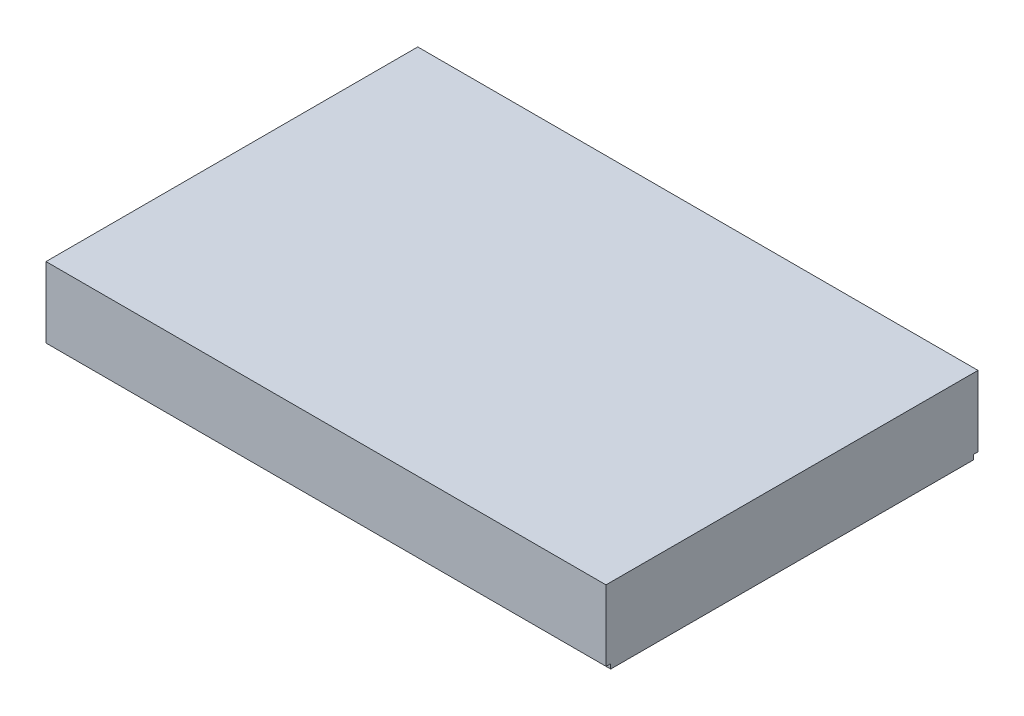
ISO-10303-21;
HEADER;
FILE_DESCRIPTION(('STEP AP214'),'2;1');
FILE_NAME('part.step','',(''),(''),'','','');
FILE_SCHEMA(('AUTOMOTIVE_DESIGN { 1 0 10303 214 1 1 1 1 }'));
ENDSEC;
DATA;
#1=APPLICATION_CONTEXT('core data for automotive mechanical design processes');
#2=APPLICATION_PROTOCOL_DEFINITION('international standard','automotive_design',2000,#1);
#3=PRODUCT_CONTEXT('',#1,'mechanical');
#4=PRODUCT('Part','Part','',(#3));
#5=PRODUCT_RELATED_PRODUCT_CATEGORY('part','',(#4));
#6=PRODUCT_DEFINITION_FORMATION('','',#4);
#7=PRODUCT_DEFINITION_CONTEXT('part definition',#1,'design');
#8=PRODUCT_DEFINITION('design','',#6,#7);
#9=PRODUCT_DEFINITION_SHAPE('','',#8);
#10=(LENGTH_UNIT() NAMED_UNIT(*) SI_UNIT(.MILLI.,.METRE.));
#11=(NAMED_UNIT(*) PLANE_ANGLE_UNIT() SI_UNIT($,.RADIAN.));
#12=(NAMED_UNIT(*) SI_UNIT($,.STERADIAN.) SOLID_ANGLE_UNIT());
#13=UNCERTAINTY_MEASURE_WITH_UNIT(LENGTH_MEASURE(1.E-05),#10,'distance_accuracy_value','');
#14=(GEOMETRIC_REPRESENTATION_CONTEXT(3) GLOBAL_UNCERTAINTY_ASSIGNED_CONTEXT((#13)) GLOBAL_UNIT_ASSIGNED_CONTEXT((#10,
#11,#12)) REPRESENTATION_CONTEXT('',''));
#15=CARTESIAN_POINT('',(0.,0.,0.));
#16=DIRECTION('',(0.,0.,1.));
#17=DIRECTION('',(1.,0.,0.));
#18=AXIS2_PLACEMENT_3D('',#15,#16,#17);
#19=CARTESIAN_POINT('',(0.681967213114738,0.,7.9));
#20=DIRECTION('',(0.,1.,0.));
#21=DIRECTION('',(0.,0.,1.));
#22=AXIS2_PLACEMENT_3D('',#19,#20,#21);
#23=PLANE('',#22);
#24=DIRECTION('',(-0.000706908069581635,0.,0.999999750140459));
#25=VECTOR('',#24,1.);
#26=CARTESIAN_POINT('',(24.4819553198021,0.,7.9168244078523));
#27=LINE('',#26,#25);
#28=CARTESIAN_POINT('',(24.4929949817556,0.,-7.7));
#29=VERTEX_POINT('',#28);
#30=CARTESIAN_POINT('',(24.482108594764,0.,7.7));
#31=VERTEX_POINT('',#30);
#32=EDGE_CURVE('E375',#29,#31,#27,.T.);
#33=ORIENTED_EDGE('',*,*,#32,.T.);
#34=DIRECTION('',(1.,0.,0.));
#35=VECTOR('',#34,1.);
#36=CARTESIAN_POINT('',(48.2819672131147,0.,7.7));
#37=LINE('',#36,#35);
#38=CARTESIAN_POINT('',(0.881967213114738,0.,7.7));
#39=VERTEX_POINT('',#38);
#40=EDGE_CURVE('E340',#39,#31,#37,.T.);
#41=ORIENTED_EDGE('',*,*,#40,.F.);
#42=DIRECTION('',(0.,0.,1.));
#43=VECTOR('',#42,1.);
#44=CARTESIAN_POINT('',(0.881967213114738,0.,-7.7021840237475));
#45=LINE('',#44,#43);
#46=CARTESIAN_POINT('',(0.881967213114738,0.,-7.7));
#47=VERTEX_POINT('',#46);
#48=EDGE_CURVE('E245',#47,#39,#45,.T.);
#49=ORIENTED_EDGE('',*,*,#48,.F.);
#50=DIRECTION('',(-1.,0.,0.));
#51=VECTOR('',#50,1.);
#52=CARTESIAN_POINT('',(0.881967213114738,0.,-7.7));
#53=LINE('',#52,#51);
#54=EDGE_CURVE('E241',#29,#47,#53,.T.);
#55=ORIENTED_EDGE('',*,*,#54,.F.);
#56=EDGE_LOOP('',(#33,#41,#49,#55));
#57=FACE_BOUND('',#56,.T.);
#58=DIRECTION('',(0.,0.,-1.));
#59=VECTOR('',#58,1.);
#60=CARTESIAN_POINT('',(23.2922880735094,0.,-6.7));
#61=LINE('',#60,#59);
#62=CARTESIAN_POINT('',(23.2922880735094,0.,6.7));
#63=VERTEX_POINT('',#62);
#64=CARTESIAN_POINT('',(23.2922880735094,0.,-6.7));
#65=VERTEX_POINT('',#64);
#66=EDGE_CURVE('E167',#63,#65,#61,.T.);
#67=ORIENTED_EDGE('',*,*,#66,.T.);
#68=DIRECTION('',(1.,0.,0.));
#69=VECTOR('',#68,1.);
#70=CARTESIAN_POINT('',(0.,0.,-6.7));
#71=LINE('',#70,#69);
#72=CARTESIAN_POINT('',(1.88196721311474,0.,-6.7));
#73=VERTEX_POINT('',#72);
#74=EDGE_CURVE('E195',#73,#65,#71,.T.);
#75=ORIENTED_EDGE('',*,*,#74,.F.);
#76=DIRECTION('',(0.,0.,-1.));
#77=VECTOR('',#76,1.);
#78=CARTESIAN_POINT('',(1.88196721311474,0.,7.9));
#79=LINE('',#78,#77);
#80=CARTESIAN_POINT('',(1.88196721311474,0.,6.7));
#81=VERTEX_POINT('',#80);
#82=EDGE_CURVE('E186',#81,#73,#79,.T.);
#83=ORIENTED_EDGE('',*,*,#82,.F.);
#84=DIRECTION('',(1.,0.,0.));
#85=VECTOR('',#84,1.);
#86=CARTESIAN_POINT('',(0.,0.,6.7));
#87=LINE('',#86,#85);
#88=EDGE_CURVE('E182',#81,#63,#87,.T.);
#89=ORIENTED_EDGE('',*,*,#88,.T.);
#90=EDGE_LOOP('',(#67,#75,#83,#89));
#91=FACE_BOUND('',#90,.T.);
#92=ADVANCED_FACE('F41',(#57,#91),#23,.F.);
#93=CARTESIAN_POINT('',(0.681967213114738,0.,7.9));
#94=DIRECTION('',(1.,0.,0.));
#95=DIRECTION('',(0.,0.,-1.));
#96=AXIS2_PLACEMENT_3D('',#93,#94,#95);
#97=PLANE('',#96);
#98=DIRECTION('',(0.,-1.,0.));
#99=VECTOR('',#98,1.);
#100=CARTESIAN_POINT('',(0.681967213114738,0.,-7.9));
#101=LINE('',#100,#99);
#102=CARTESIAN_POINT('',(0.681967213114738,3.2,-7.9));
#103=VERTEX_POINT('',#102);
#104=CARTESIAN_POINT('',(0.681967213114738,0.199766915545216,-7.9));
#105=VERTEX_POINT('',#104);
#106=EDGE_CURVE('E204',#103,#105,#101,.T.);
#107=ORIENTED_EDGE('',*,*,#106,.T.);
#108=DIRECTION('',(0.,0.,-1.));
#109=VECTOR('',#108,1.);
#110=CARTESIAN_POINT('',(0.681967213114738,0.199766915545216,-7.9));
#111=LINE('',#110,#109);
#112=CARTESIAN_POINT('',(0.681967213114738,0.199766915545217,7.9));
#113=VERTEX_POINT('',#112);
#114=EDGE_CURVE('E244',#113,#105,#111,.T.);
#115=ORIENTED_EDGE('',*,*,#114,.F.);
#116=DIRECTION('',(0.,-1.,0.));
#117=VECTOR('',#116,1.);
#118=CARTESIAN_POINT('',(0.681967213114738,0.,7.9));
#119=LINE('',#118,#117);
#120=CARTESIAN_POINT('',(0.681967213114738,3.2,7.9));
#121=VERTEX_POINT('',#120);
#122=EDGE_CURVE('E197',#121,#113,#119,.T.);
#123=ORIENTED_EDGE('',*,*,#122,.F.);
#124=DIRECTION('',(0.,0.,-1.));
#125=VECTOR('',#124,1.);
#126=CARTESIAN_POINT('',(0.681967213114738,3.2,7.9));
#127=LINE('',#126,#125);
#128=EDGE_CURVE('E203',#121,#103,#127,.T.);
#129=ORIENTED_EDGE('',*,*,#128,.T.);
#130=EDGE_LOOP('',(#107,#115,#123,#129));
#131=FACE_BOUND('',#130,.T.);
#132=ADVANCED_FACE('F396',(#131),#97,.F.);
#133=CARTESIAN_POINT('',(0.681967213114738,3.2,7.9));
#134=DIRECTION('',(0.,-1.,0.));
#135=DIRECTION('',(1.,0.,0.));
#136=AXIS2_PLACEMENT_3D('',#133,#134,#135);
#137=PLANE('',#136);
#138=DIRECTION('',(-1.,0.,0.));
#139=VECTOR('',#138,1.);
#140=CARTESIAN_POINT('',(0.681967213114738,3.2,7.9));
#141=LINE('',#140,#139);
#142=CARTESIAN_POINT('',(24.4819672131147,3.2,7.9));
#143=VERTEX_POINT('',#142);
#144=EDGE_CURVE('E200',#143,#121,#141,.T.);
#145=ORIENTED_EDGE('',*,*,#144,.F.);
#146=DIRECTION('',(0.000706908069581635,0.,-0.999999750140459));
#147=VECTOR('',#146,1.);
#148=CARTESIAN_POINT('',(24.4931363634049,3.2,-7.9));
#149=LINE('',#148,#147);
#150=CARTESIAN_POINT('',(24.4931363634049,3.2,-7.9));
#151=VERTEX_POINT('',#150);
#152=EDGE_CURVE('E377',#143,#151,#149,.T.);
#153=ORIENTED_EDGE('',*,*,#152,.T.);
#154=DIRECTION('',(-1.,0.,0.));
#155=VECTOR('',#154,1.);
#156=CARTESIAN_POINT('',(0.681967213114738,3.2,-7.9));
#157=LINE('',#156,#155);
#158=EDGE_CURVE('E201',#151,#103,#157,.T.);
#159=ORIENTED_EDGE('',*,*,#158,.T.);
#160=ORIENTED_EDGE('',*,*,#128,.F.);
#161=EDGE_LOOP('',(#145,#153,#159,#160));
#162=FACE_BOUND('',#161,.T.);
#163=ADVANCED_FACE('F398',(#162),#137,.F.);
#164=CARTESIAN_POINT('',(0.,0.,7.9));
#165=DIRECTION('',(0.,0.,-1.));
#166=DIRECTION('',(-1.,0.,0.));
#167=AXIS2_PLACEMENT_3D('',#164,#165,#166);
#168=PLANE('',#167);
#169=DIRECTION('',(-1.,0.,0.));
#170=VECTOR('',#169,1.);
#171=CARTESIAN_POINT('',(0.881967213114738,0.199766915545217,7.9));
#172=LINE('',#171,#170);
#173=CARTESIAN_POINT('',(24.4819672131147,0.199766915545216,7.9));
#174=VERTEX_POINT('',#173);
#175=EDGE_CURVE('E250',#174,#113,#172,.T.);
#176=ORIENTED_EDGE('',*,*,#175,.F.);
#177=DIRECTION('',(0.,-1.,0.));
#178=VECTOR('',#177,1.);
#179=CARTESIAN_POINT('',(24.4819672131147,3.2,7.9));
#180=LINE('',#179,#178);
#181=EDGE_CURVE('E373',#143,#174,#180,.T.);
#182=ORIENTED_EDGE('',*,*,#181,.F.);
#183=ORIENTED_EDGE('',*,*,#144,.T.);
#184=ORIENTED_EDGE('',*,*,#122,.T.);
#185=EDGE_LOOP('',(#176,#182,#183,#184));
#186=FACE_BOUND('',#185,.T.);
#187=ADVANCED_FACE('F391',(#186),#168,.F.);
#188=CARTESIAN_POINT('',(0.,0.,-7.9));
#189=DIRECTION('',(0.,0.,-1.));
#190=DIRECTION('',(-1.,0.,0.));
#191=AXIS2_PLACEMENT_3D('',#188,#189,#190);
#192=PLANE('',#191);
#193=DIRECTION('',(0.,-1.,0.));
#194=VECTOR('',#193,1.);
#195=CARTESIAN_POINT('',(24.4931363634049,3.2,-7.9));
#196=LINE('',#195,#194);
#197=CARTESIAN_POINT('',(24.4931363634049,0.201578175841326,-7.9));
#198=VERTEX_POINT('',#197);
#199=EDGE_CURVE('E371',#151,#198,#196,.T.);
#200=ORIENTED_EDGE('',*,*,#199,.T.);
#201=DIRECTION('',(0.999999997057616,7.67122416557049E-05,0.));
#202=VECTOR('',#201,1.);
#203=CARTESIAN_POINT('',(48.4819672131147,0.203418418258773,-7.9));
#204=LINE('',#203,#202);
#205=CARTESIAN_POINT('',(0.881967213114738,0.199766915545217,-7.9));
#206=VERTEX_POINT('',#205);
#207=EDGE_CURVE('E238',#206,#198,#204,.T.);
#208=ORIENTED_EDGE('',*,*,#207,.F.);
#209=DIRECTION('',(-1.,0.,0.));
#210=VECTOR('',#209,1.);
#211=CARTESIAN_POINT('',(0.881967213114738,0.199766915545216,-7.9));
#212=LINE('',#211,#210);
#213=EDGE_CURVE('E252',#206,#105,#212,.T.);
#214=ORIENTED_EDGE('',*,*,#213,.T.);
#215=ORIENTED_EDGE('',*,*,#106,.F.);
#216=ORIENTED_EDGE('',*,*,#158,.F.);
#217=EDGE_LOOP('',(#200,#208,#214,#215,#216));
#218=FACE_BOUND('',#217,.T.);
#219=ADVANCED_FACE('F368',(#218),#192,.T.);
#220=CARTESIAN_POINT('',(1.88196721311474,0.,7.9));
#221=DIRECTION('',(1.,0.,0.));
#222=DIRECTION('',(0.,0.,-1.));
#223=AXIS2_PLACEMENT_3D('',#220,#221,#222);
#224=PLANE('',#223);
#225=DIRECTION('',(0.,-1.,0.));
#226=VECTOR('',#225,1.);
#227=CARTESIAN_POINT('',(1.88196721311474,2.4,-2.49948215339272));
#228=LINE('',#227,#226);
#229=CARTESIAN_POINT('',(1.88196721311474,2.2,-2.49948215339272));
#230=VERTEX_POINT('',#229);
#231=CARTESIAN_POINT('',(1.88196721311474,2.,-2.49948215339272));
#232=VERTEX_POINT('',#231);
#233=EDGE_CURVE('E288',#230,#232,#228,.T.);
#234=ORIENTED_EDGE('',*,*,#233,.F.);
#235=DIRECTION('',(0.,0.,-1.));
#236=VECTOR('',#235,1.);
#237=CARTESIAN_POINT('',(1.88196721311474,2.2,7.9));
#238=LINE('',#237,#236);
#239=CARTESIAN_POINT('',(1.88196721311474,2.2,2.50210016185098));
#240=VERTEX_POINT('',#239);
#241=EDGE_CURVE('E290',#230,#240,#238,.F.);
#242=ORIENTED_EDGE('',*,*,#241,.T.);
#243=DIRECTION('',(0.,-1.,0.));
#244=VECTOR('',#243,1.);
#245=CARTESIAN_POINT('',(1.88196721311474,2.4,2.50210016185098));
#246=LINE('',#245,#244);
#247=CARTESIAN_POINT('',(1.88196721311474,2.,2.50210016185098));
#248=VERTEX_POINT('',#247);
#249=EDGE_CURVE('E338',#240,#248,#246,.T.);
#250=ORIENTED_EDGE('',*,*,#249,.T.);
#251=DIRECTION('',(0.,0.,-1.));
#252=VECTOR('',#251,1.);
#253=CARTESIAN_POINT('',(1.88196721311474,2.,7.9));
#254=LINE('',#253,#252);
#255=CARTESIAN_POINT('',(1.88196721311474,2.,6.7));
#256=VERTEX_POINT('',#255);
#257=EDGE_CURVE('E267',#256,#248,#254,.T.);
#258=ORIENTED_EDGE('',*,*,#257,.F.);
#259=DIRECTION('',(0.,-1.,0.));
#260=VECTOR('',#259,1.);
#261=CARTESIAN_POINT('',(1.88196721311474,0.,6.7));
#262=LINE('',#261,#260);
#263=EDGE_CURVE('E187',#256,#81,#262,.T.);
#264=ORIENTED_EDGE('',*,*,#263,.T.);
#265=ORIENTED_EDGE('',*,*,#82,.T.);
#266=DIRECTION('',(0.,-1.,0.));
#267=VECTOR('',#266,1.);
#268=CARTESIAN_POINT('',(1.88196721311474,0.,-6.7));
#269=LINE('',#268,#267);
#270=CARTESIAN_POINT('',(1.88196721311474,2.,-6.7));
#271=VERTEX_POINT('',#270);
#272=EDGE_CURVE('E217',#271,#73,#269,.T.);
#273=ORIENTED_EDGE('',*,*,#272,.F.);
#274=EDGE_CURVE('E189',#232,#271,#254,.T.);
#275=ORIENTED_EDGE('',*,*,#274,.F.);
#276=EDGE_LOOP('',(#234,#242,#250,#258,#264,#265,#273,#275));
#277=FACE_BOUND('',#276,.T.);
#278=ADVANCED_FACE('F273',(#277),#224,.T.);
#279=CARTESIAN_POINT('',(0.681967213114738,2.,7.9));
#280=DIRECTION('',(0.,-1.,0.));
#281=DIRECTION('',(1.,0.,0.));
#282=AXIS2_PLACEMENT_3D('',#279,#280,#281);
#283=PLANE('',#282);
#284=DIRECTION('',(0.,0.,-1.));
#285=VECTOR('',#284,1.);
#286=CARTESIAN_POINT('',(23.2922880735094,2.,-6.7));
#287=LINE('',#286,#285);
#288=CARTESIAN_POINT('',(23.2922880735094,2.,6.7));
#289=VERTEX_POINT('',#288);
#290=CARTESIAN_POINT('',(23.2922880735094,2.,-6.7));
#291=VERTEX_POINT('',#290);
#292=EDGE_CURVE('E56',#289,#291,#287,.T.);
#293=ORIENTED_EDGE('',*,*,#292,.F.);
#294=DIRECTION('',(-1.,0.,0.));
#295=VECTOR('',#294,1.);
#296=CARTESIAN_POINT('',(0.,2.,6.7));
#297=LINE('',#296,#295);
#298=EDGE_CURVE('E184',#289,#256,#297,.T.);
#299=ORIENTED_EDGE('',*,*,#298,.T.);
#300=ORIENTED_EDGE('',*,*,#257,.T.);
#301=DIRECTION('',(-1.,0.,0.));
#302=VECTOR('',#301,1.);
#303=CARTESIAN_POINT('',(1.88196721311474,2.,2.50210016185098));
#304=LINE('',#303,#302);
#305=CARTESIAN_POINT('',(2.38194248084373,2.,2.50210016185098));
#306=VERTEX_POINT('',#305);
#307=EDGE_CURVE('E294',#306,#248,#304,.T.);
#308=ORIENTED_EDGE('',*,*,#307,.F.);
#309=DIRECTION('',(0.,0.,1.));
#310=VECTOR('',#309,1.);
#311=CARTESIAN_POINT('',(2.38194248084373,2.,2.50210016185098));
#312=LINE('',#311,#310);
#313=CARTESIAN_POINT('',(2.38194248084373,2.,-2.49948215339272));
#314=VERTEX_POINT('',#313);
#315=EDGE_CURVE('E329',#314,#306,#312,.T.);
#316=ORIENTED_EDGE('',*,*,#315,.F.);
#317=DIRECTION('',(1.,0.,0.));
#318=VECTOR('',#317,1.);
#319=CARTESIAN_POINT('',(2.38194248084373,2.,-2.49948215339272));
#320=LINE('',#319,#318);
#321=EDGE_CURVE('E286',#232,#314,#320,.T.);
#322=ORIENTED_EDGE('',*,*,#321,.F.);
#323=ORIENTED_EDGE('',*,*,#274,.T.);
#324=DIRECTION('',(-1.,0.,0.));
#325=VECTOR('',#324,1.);
#326=CARTESIAN_POINT('',(0.,2.,-6.7));
#327=LINE('',#326,#325);
#328=EDGE_CURVE('E191',#291,#271,#327,.T.);
#329=ORIENTED_EDGE('',*,*,#328,.F.);
#330=EDGE_LOOP('',(#293,#299,#300,#308,#316,#322,#323,#329));
#331=FACE_BOUND('',#330,.T.);
#332=CARTESIAN_POINT('',(16.5819672131147,2.,0.));
#333=DIRECTION('',(0.,-1.,0.));
#334=DIRECTION('',(1.,0.,0.));
#335=AXIS2_PLACEMENT_3D('',#332,#333,#334);
#336=CIRCLE('',#335,3.25);
#337=CARTESIAN_POINT('',(19.8319672131147,2.,0.));
#338=VERTEX_POINT('',#337);
#339=EDGE_CURVE('E222',#338,#338,#336,.F.);
#340=ORIENTED_EDGE('',*,*,#339,.T.);
#341=EDGE_LOOP('',(#340));
#342=FACE_BOUND('',#341,.T.);
#343=CARTESIAN_POINT('',(8.58196721311474,2.,0.));
#344=DIRECTION('',(0.,-1.,0.));
#345=DIRECTION('',(1.,0.,0.));
#346=AXIS2_PLACEMENT_3D('',#343,#344,#345);
#347=CIRCLE('',#346,3.25);
#348=CARTESIAN_POINT('',(11.8319672131147,2.,0.));
#349=VERTEX_POINT('',#348);
#350=EDGE_CURVE('E214',#349,#349,#347,.F.);
#351=ORIENTED_EDGE('',*,*,#350,.T.);
#352=EDGE_LOOP('',(#351));
#353=FACE_BOUND('',#352,.T.);
#354=ADVANCED_FACE('F282',(#331,#342,#353),#283,.T.);
#355=CARTESIAN_POINT('',(0.,0.,6.7));
#356=DIRECTION('',(0.,0.,-1.));
#357=DIRECTION('',(-1.,0.,0.));
#358=AXIS2_PLACEMENT_3D('',#355,#356,#357);
#359=PLANE('',#358);
#360=DIRECTION('',(0.,1.,0.));
#361=VECTOR('',#360,1.);
#362=CARTESIAN_POINT('',(23.2922880735094,0.,6.7));
#363=LINE('',#362,#361);
#364=EDGE_CURVE('E170',#63,#289,#363,.T.);
#365=ORIENTED_EDGE('',*,*,#364,.F.);
#366=ORIENTED_EDGE('',*,*,#88,.F.);
#367=ORIENTED_EDGE('',*,*,#263,.F.);
#368=ORIENTED_EDGE('',*,*,#298,.F.);
#369=EDGE_LOOP('',(#365,#366,#367,#368));
#370=FACE_BOUND('',#369,.T.);
#371=ADVANCED_FACE('F180',(#370),#359,.T.);
#372=CARTESIAN_POINT('',(0.,0.,-6.7));
#373=DIRECTION('',(0.,0.,-1.));
#374=DIRECTION('',(-1.,0.,0.));
#375=AXIS2_PLACEMENT_3D('',#372,#373,#374);
#376=PLANE('',#375);
#377=ORIENTED_EDGE('',*,*,#74,.T.);
#378=DIRECTION('',(0.,1.,0.));
#379=VECTOR('',#378,1.);
#380=CARTESIAN_POINT('',(23.2922880735094,0.,-6.7));
#381=LINE('',#380,#379);
#382=EDGE_CURVE('E171',#65,#291,#381,.T.);
#383=ORIENTED_EDGE('',*,*,#382,.T.);
#384=ORIENTED_EDGE('',*,*,#328,.T.);
#385=ORIENTED_EDGE('',*,*,#272,.T.);
#386=EDGE_LOOP('',(#377,#383,#384,#385));
#387=FACE_BOUND('',#386,.T.);
#388=ADVANCED_FACE('F277',(#387),#376,.F.);
#389=CARTESIAN_POINT('',(8.58196721311474,-0.2,0.));
#390=DIRECTION('',(0.,-1.,0.));
#391=DIRECTION('',(0.,0.,-1.));
#392=AXIS2_PLACEMENT_3D('',#389,#390,#391);
#393=PLANE('',#392);
#394=CARTESIAN_POINT('',(8.58196721311474,-0.2,0.));
#395=DIRECTION('',(0.,-1.,0.));
#396=DIRECTION('',(0.,0.,-1.));
#397=AXIS2_PLACEMENT_3D('',#394,#395,#396);
#398=CIRCLE('',#397,3.25);
#399=CARTESIAN_POINT('',(8.58196721311474,-0.2,-3.25));
#400=VERTEX_POINT('',#399);
#401=EDGE_CURVE('E218',#400,#400,#398,.T.);
#402=ORIENTED_EDGE('',*,*,#401,.T.);
#403=EDGE_LOOP('',(#402));
#404=FACE_BOUND('',#403,.T.);
#405=CARTESIAN_POINT('',(8.58196721311474,-0.2,0.));
#406=DIRECTION('',(0.,-1.,0.));
#407=DIRECTION('',(0.,0.,-1.));
#408=AXIS2_PLACEMENT_3D('',#405,#406,#407);
#409=CIRCLE('',#408,2.4);
#410=CARTESIAN_POINT('',(8.58196721311474,-0.2,-2.4));
#411=VERTEX_POINT('',#410);
#412=EDGE_CURVE('E225',#411,#411,#409,.T.);
#413=ORIENTED_EDGE('',*,*,#412,.F.);
#414=EDGE_LOOP('',(#413));
#415=FACE_BOUND('',#414,.T.);
#416=ADVANCED_FACE('F487',(#404,#415),#393,.T.);
#417=CARTESIAN_POINT('',(8.58196721311474,-0.2,0.));
#418=DIRECTION('',(0.,1.,0.));
#419=DIRECTION('',(0.,0.,1.));
#420=AXIS2_PLACEMENT_3D('',#417,#418,#419);
#421=CYLINDRICAL_SURFACE('',#420,3.25);
#422=ORIENTED_EDGE('',*,*,#350,.F.);
#423=EDGE_LOOP('',(#422));
#424=FACE_BOUND('',#423,.T.);
#425=ORIENTED_EDGE('',*,*,#401,.F.);
#426=EDGE_LOOP('',(#425));
#427=FACE_BOUND('',#426,.T.);
#428=ADVANCED_FACE('F485',(#424,#427),#421,.T.);
#429=CARTESIAN_POINT('',(8.58196721311474,-0.2,0.));
#430=DIRECTION('',(0.,1.,0.));
#431=DIRECTION('',(0.,0.,1.));
#432=AXIS2_PLACEMENT_3D('',#429,#430,#431);
#433=CYLINDRICAL_SURFACE('',#432,2.4);
#434=CARTESIAN_POINT('',(8.58196721311474,2.,0.));
#435=DIRECTION('',(0.,-1.,0.));
#436=DIRECTION('',(1.,0.,0.));
#437=AXIS2_PLACEMENT_3D('',#434,#435,#436);
#438=CIRCLE('',#437,2.4);
#439=CARTESIAN_POINT('',(10.9819672131147,2.,0.));
#440=VERTEX_POINT('',#439);
#441=EDGE_CURVE('E210',#440,#440,#438,.F.);
#442=ORIENTED_EDGE('',*,*,#441,.T.);
#443=EDGE_LOOP('',(#442));
#444=FACE_BOUND('',#443,.T.);
#445=ORIENTED_EDGE('',*,*,#412,.T.);
#446=EDGE_LOOP('',(#445));
#447=FACE_BOUND('',#446,.T.);
#448=ADVANCED_FACE('F482',(#444,#447),#433,.F.);
#449=ORIENTED_EDGE('',*,*,#441,.F.);
#450=EDGE_LOOP('',(#449));
#451=FACE_BOUND('',#450,.T.);
#452=ADVANCED_FACE('F477',(#451),#283,.T.);
#453=CARTESIAN_POINT('',(16.5819672131147,-0.2,0.));
#454=DIRECTION('',(0.,-1.,0.));
#455=DIRECTION('',(0.,0.,-1.));
#456=AXIS2_PLACEMENT_3D('',#453,#454,#455);
#457=PLANE('',#456);
#458=CARTESIAN_POINT('',(16.5819672131147,-0.2,0.));
#459=DIRECTION('',(0.,-1.,0.));
#460=DIRECTION('',(0.,0.,-1.));
#461=AXIS2_PLACEMENT_3D('',#458,#459,#460);
#462=CIRCLE('',#461,3.25);
#463=CARTESIAN_POINT('',(16.5819672131147,-0.2,-3.25));
#464=VERTEX_POINT('',#463);
#465=EDGE_CURVE('E226',#464,#464,#462,.T.);
#466=ORIENTED_EDGE('',*,*,#465,.T.);
#467=EDGE_LOOP('',(#466));
#468=FACE_BOUND('',#467,.T.);
#469=CARTESIAN_POINT('',(16.5819672131147,-0.2,0.));
#470=DIRECTION('',(0.,-1.,0.));
#471=DIRECTION('',(0.,0.,-1.));
#472=AXIS2_PLACEMENT_3D('',#469,#470,#471);
#473=CIRCLE('',#472,2.4);
#474=CARTESIAN_POINT('',(16.5819672131147,-0.2,-2.4));
#475=VERTEX_POINT('',#474);
#476=EDGE_CURVE('E255',#475,#475,#473,.T.);
#477=ORIENTED_EDGE('',*,*,#476,.F.);
#478=EDGE_LOOP('',(#477));
#479=FACE_BOUND('',#478,.T.);
#480=ADVANCED_FACE('F474',(#468,#479),#457,.T.);
#481=CARTESIAN_POINT('',(16.5819672131147,-0.2,0.));
#482=DIRECTION('',(0.,1.,0.));
#483=DIRECTION('',(0.,0.,1.));
#484=AXIS2_PLACEMENT_3D('',#481,#482,#483);
#485=CYLINDRICAL_SURFACE('',#484,3.25);
#486=ORIENTED_EDGE('',*,*,#339,.F.);
#487=EDGE_LOOP('',(#486));
#488=FACE_BOUND('',#487,.T.);
#489=ORIENTED_EDGE('',*,*,#465,.F.);
#490=EDGE_LOOP('',(#489));
#491=FACE_BOUND('',#490,.T.);
#492=ADVANCED_FACE('F472',(#488,#491),#485,.T.);
#493=CARTESIAN_POINT('',(16.5819672131147,-0.2,0.));
#494=DIRECTION('',(0.,1.,0.));
#495=DIRECTION('',(0.,0.,1.));
#496=AXIS2_PLACEMENT_3D('',#493,#494,#495);
#497=CYLINDRICAL_SURFACE('',#496,2.4);
#498=CARTESIAN_POINT('',(16.5819672131147,2.,0.));
#499=DIRECTION('',(0.,-1.,0.));
#500=DIRECTION('',(1.,0.,0.));
#501=AXIS2_PLACEMENT_3D('',#498,#499,#500);
#502=CIRCLE('',#501,2.4);
#503=CARTESIAN_POINT('',(18.9819672131147,2.,0.));
#504=VERTEX_POINT('',#503);
#505=EDGE_CURVE('E213',#504,#504,#502,.F.);
#506=ORIENTED_EDGE('',*,*,#505,.T.);
#507=EDGE_LOOP('',(#506));
#508=FACE_BOUND('',#507,.T.);
#509=ORIENTED_EDGE('',*,*,#476,.T.);
#510=EDGE_LOOP('',(#509));
#511=FACE_BOUND('',#510,.T.);
#512=ADVANCED_FACE('F469',(#508,#511),#497,.F.);
#513=ORIENTED_EDGE('',*,*,#505,.F.);
#514=EDGE_LOOP('',(#513));
#515=FACE_BOUND('',#514,.T.);
#516=ADVANCED_FACE('F468',(#515),#283,.T.);
#517=CARTESIAN_POINT('',(0.881967213114738,0.199766915545216,-7.9));
#518=DIRECTION('',(0.,1.,0.));
#519=DIRECTION('',(0.,0.,1.));
#520=AXIS2_PLACEMENT_3D('',#517,#518,#519);
#521=PLANE('',#520);
#522=DIRECTION('',(-1.,0.,0.));
#523=VECTOR('',#522,1.);
#524=CARTESIAN_POINT('',(0.881967213114738,0.199766915545217,7.7));
#525=LINE('',#524,#523);
#526=CARTESIAN_POINT('',(24.482108594764,0.199766915545217,7.7));
#527=VERTEX_POINT('',#526);
#528=CARTESIAN_POINT('',(0.881967213114738,0.199766915545217,7.7));
#529=VERTEX_POINT('',#528);
#530=EDGE_CURVE('E346',#527,#529,#525,.T.);
#531=ORIENTED_EDGE('',*,*,#530,.F.);
#532=DIRECTION('',(-0.000706908069581635,0.,0.999999750140459));
#533=VECTOR('',#532,1.);
#534=CARTESIAN_POINT('',(24.4931245644546,0.199766915545216,-7.88330907816579));
#535=LINE('',#534,#533);
#536=EDGE_CURVE('E64',#527,#174,#535,.T.);
#537=ORIENTED_EDGE('',*,*,#536,.T.);
#538=ORIENTED_EDGE('',*,*,#175,.T.);
#539=ORIENTED_EDGE('',*,*,#114,.T.);
#540=ORIENTED_EDGE('',*,*,#213,.F.);
#541=DIRECTION('',(0.,0.,-1.));
#542=VECTOR('',#541,1.);
#543=CARTESIAN_POINT('',(0.881967213114738,0.199766915545217,-7.7));
#544=LINE('',#543,#542);
#545=CARTESIAN_POINT('',(0.881967213114738,0.199766915545217,-7.7));
#546=VERTEX_POINT('',#545);
#547=EDGE_CURVE('E231',#546,#206,#544,.T.);
#548=ORIENTED_EDGE('',*,*,#547,.F.);
#549=DIRECTION('',(0.,0.,-1.));
#550=VECTOR('',#549,1.);
#551=CARTESIAN_POINT('',(0.881967213114738,0.199766915545217,7.9));
#552=LINE('',#551,#550);
#553=EDGE_CURVE('E248',#529,#546,#552,.T.);
#554=ORIENTED_EDGE('',*,*,#553,.F.);
#555=EDGE_LOOP('',(#531,#537,#538,#539,#540,#548,#554));
#556=FACE_BOUND('',#555,.T.);
#557=ADVANCED_FACE('F362',(#556),#521,.F.);
#558=CARTESIAN_POINT('',(0.881967213114738,0.,0.));
#559=DIRECTION('',(1.,0.,0.));
#560=DIRECTION('',(0.,0.,-1.));
#561=AXIS2_PLACEMENT_3D('',#558,#559,#560);
#562=PLANE('',#561);
#563=ORIENTED_EDGE('',*,*,#48,.T.);
#564=DIRECTION('',(0.,-1.,0.));
#565=VECTOR('',#564,1.);
#566=CARTESIAN_POINT('',(0.881967213114738,0.,7.7));
#567=LINE('',#566,#565);
#568=EDGE_CURVE('E242',#529,#39,#567,.T.);
#569=ORIENTED_EDGE('',*,*,#568,.F.);
#570=ORIENTED_EDGE('',*,*,#553,.T.);
#571=DIRECTION('',(0.,1.,0.));
#572=VECTOR('',#571,1.);
#573=CARTESIAN_POINT('',(0.881967213114738,0.199766915545217,-7.7));
#574=LINE('',#573,#572);
#575=EDGE_CURVE('E232',#47,#546,#574,.T.);
#576=ORIENTED_EDGE('',*,*,#575,.F.);
#577=EDGE_LOOP('',(#563,#569,#570,#576));
#578=FACE_BOUND('',#577,.T.);
#579=ADVANCED_FACE('F384',(#578),#562,.F.);
#580=CARTESIAN_POINT('',(48.4819672131147,0.203418418258773,-7.7));
#581=DIRECTION('',(-7.67122416557049E-05,0.999999997057616,0.));
#582=DIRECTION('',(-0.999999997057616,-7.67122416557049E-05,0.));
#583=AXIS2_PLACEMENT_3D('',#580,#581,#582);
#584=PLANE('',#583);
#585=ORIENTED_EDGE('',*,*,#207,.T.);
#586=DIRECTION('',(-0.000706908069581634,-5.42285028216752E-08,0.999999750140458));
#587=VECTOR('',#586,1.);
#588=CARTESIAN_POINT('',(24.4930069695013,0.201578171338081,-7.71695799391399));
#589=LINE('',#588,#587);
#590=CARTESIAN_POINT('',(24.4929949817556,0.201578170418474,-7.7));
#591=VERTEX_POINT('',#590);
#592=EDGE_CURVE('E314',#198,#591,#589,.T.);
#593=ORIENTED_EDGE('',*,*,#592,.T.);
#594=DIRECTION('',(0.999999997057616,7.67122416557049E-05,0.));
#595=VECTOR('',#594,1.);
#596=CARTESIAN_POINT('',(48.4819672131147,0.203418418258773,-7.7));
#597=LINE('',#596,#595);
#598=EDGE_CURVE('E227',#546,#591,#597,.T.);
#599=ORIENTED_EDGE('',*,*,#598,.F.);
#600=ORIENTED_EDGE('',*,*,#547,.T.);
#601=EDGE_LOOP('',(#585,#593,#599,#600));
#602=FACE_BOUND('',#601,.T.);
#603=ADVANCED_FACE('F365',(#602),#584,.F.);
#604=CARTESIAN_POINT('',(0.,0.,-7.7));
#605=DIRECTION('',(0.,0.,1.));
#606=DIRECTION('',(1.,0.,0.));
#607=AXIS2_PLACEMENT_3D('',#604,#605,#606);
#608=PLANE('',#607);
#609=ORIENTED_EDGE('',*,*,#598,.T.);
#610=DIRECTION('',(0.,-1.,0.));
#611=VECTOR('',#610,1.);
#612=CARTESIAN_POINT('',(24.4929949817556,0.,-7.7));
#613=LINE('',#612,#611);
#614=EDGE_CURVE('E319',#591,#29,#613,.T.);
#615=ORIENTED_EDGE('',*,*,#614,.T.);
#616=ORIENTED_EDGE('',*,*,#54,.T.);
#617=ORIENTED_EDGE('',*,*,#575,.T.);
#618=EDGE_LOOP('',(#609,#615,#616,#617));
#619=FACE_BOUND('',#618,.T.);
#620=ADVANCED_FACE('F354',(#619),#608,.F.);
#621=CARTESIAN_POINT('',(0.,0.,7.7));
#622=DIRECTION('',(0.,0.,-1.));
#623=DIRECTION('',(-1.,0.,0.));
#624=AXIS2_PLACEMENT_3D('',#621,#622,#623);
#625=PLANE('',#624);
#626=ORIENTED_EDGE('',*,*,#40,.T.);
#627=DIRECTION('',(0.,1.,0.));
#628=VECTOR('',#627,1.);
#629=CARTESIAN_POINT('',(24.482108594764,0.,7.7));
#630=LINE('',#629,#628);
#631=EDGE_CURVE('E11',#31,#527,#630,.T.);
#632=ORIENTED_EDGE('',*,*,#631,.T.);
#633=ORIENTED_EDGE('',*,*,#530,.T.);
#634=ORIENTED_EDGE('',*,*,#568,.T.);
#635=EDGE_LOOP('',(#626,#632,#633,#634));
#636=FACE_BOUND('',#635,.T.);
#637=ADVANCED_FACE('F386',(#636),#625,.F.);
#638=CARTESIAN_POINT('',(1.88196721311474,2.4,2.50210016185098));
#639=DIRECTION('',(0.,0.,1.));
#640=DIRECTION('',(1.,0.,0.));
#641=AXIS2_PLACEMENT_3D('',#638,#639,#640);
#642=PLANE('',#641);
#643=ORIENTED_EDGE('',*,*,#249,.F.);
#644=DIRECTION('',(-1.,0.,0.));
#645=VECTOR('',#644,1.);
#646=CARTESIAN_POINT('',(2.38194248084373,2.2,2.50210016185098));
#647=LINE('',#646,#645);
#648=CARTESIAN_POINT('',(2.38194248084373,2.2,2.50210016185098));
#649=VERTEX_POINT('',#648);
#650=EDGE_CURVE('E49',#240,#649,#647,.F.);
#651=ORIENTED_EDGE('',*,*,#650,.T.);
#652=DIRECTION('',(0.,-1.,0.));
#653=VECTOR('',#652,1.);
#654=CARTESIAN_POINT('',(2.38194248084373,2.4,2.50210016185098));
#655=LINE('',#654,#653);
#656=EDGE_CURVE('E341',#649,#306,#655,.T.);
#657=ORIENTED_EDGE('',*,*,#656,.T.);
#658=ORIENTED_EDGE('',*,*,#307,.T.);
#659=EDGE_LOOP('',(#643,#651,#657,#658));
#660=FACE_BOUND('',#659,.T.);
#661=ADVANCED_FACE('F446',(#660),#642,.F.);
#662=CARTESIAN_POINT('',(2.38194248084373,2.4,2.50210016185098));
#663=DIRECTION('',(1.,0.,0.));
#664=DIRECTION('',(0.,1.,0.));
#665=AXIS2_PLACEMENT_3D('',#662,#663,#664);
#666=PLANE('',#665);
#667=ORIENTED_EDGE('',*,*,#656,.F.);
#668=DIRECTION('',(0.,0.,1.));
#669=VECTOR('',#668,1.);
#670=CARTESIAN_POINT('',(2.38194248084373,2.2,-2.49948215339272));
#671=LINE('',#670,#669);
#672=CARTESIAN_POINT('',(2.38194248084373,2.2,-2.49948215339272));
#673=VERTEX_POINT('',#672);
#674=EDGE_CURVE('E305',#649,#673,#671,.F.);
#675=ORIENTED_EDGE('',*,*,#674,.T.);
#676=DIRECTION('',(0.,-1.,0.));
#677=VECTOR('',#676,1.);
#678=CARTESIAN_POINT('',(2.38194248084373,2.4,-2.49948215339272));
#679=LINE('',#678,#677);
#680=EDGE_CURVE('E293',#673,#314,#679,.T.);
#681=ORIENTED_EDGE('',*,*,#680,.T.);
#682=ORIENTED_EDGE('',*,*,#315,.T.);
#683=EDGE_LOOP('',(#667,#675,#681,#682));
#684=FACE_BOUND('',#683,.T.);
#685=ADVANCED_FACE('F448',(#684),#666,.F.);
#686=CARTESIAN_POINT('',(2.38194248084373,2.4,-2.49948215339272));
#687=DIRECTION('',(0.,0.,-1.));
#688=DIRECTION('',(-1.,0.,0.));
#689=AXIS2_PLACEMENT_3D('',#686,#687,#688);
#690=PLANE('',#689);
#691=ORIENTED_EDGE('',*,*,#680,.F.);
#692=DIRECTION('',(1.,0.,0.));
#693=VECTOR('',#692,1.);
#694=CARTESIAN_POINT('',(1.88196721311474,2.2,-2.49948215339272));
#695=LINE('',#694,#693);
#696=EDGE_CURVE('E312',#673,#230,#695,.F.);
#697=ORIENTED_EDGE('',*,*,#696,.T.);
#698=ORIENTED_EDGE('',*,*,#233,.T.);
#699=ORIENTED_EDGE('',*,*,#321,.T.);
#700=EDGE_LOOP('',(#691,#697,#698,#699));
#701=FACE_BOUND('',#700,.T.);
#702=ADVANCED_FACE('F434',(#701),#690,.F.);
#703=CARTESIAN_POINT('',(0.,2.4,0.));
#704=DIRECTION('',(0.,1.,0.));
#705=DIRECTION('',(0.,0.,1.));
#706=AXIS2_PLACEMENT_3D('',#703,#704,#705);
#707=PLANE('',#706);
#708=DIRECTION('',(0.,0.,-1.));
#709=VECTOR('',#708,1.);
#710=CARTESIAN_POINT('',(2.08196721311474,2.4,0.));
#711=LINE('',#710,#709);
#712=CARTESIAN_POINT('',(2.08196721311474,2.4,2.30210016185098));
#713=VERTEX_POINT('',#712);
#714=CARTESIAN_POINT('',(2.08196721311474,2.4,-2.29948215339272));
#715=VERTEX_POINT('',#714);
#716=EDGE_CURVE('E440',#713,#715,#711,.T.);
#717=ORIENTED_EDGE('',*,*,#716,.T.);
#718=DIRECTION('',(1.,0.,0.));
#719=VECTOR('',#718,1.);
#720=CARTESIAN_POINT('',(2.38194248084373,2.4,-2.29948215339272));
#721=LINE('',#720,#719);
#722=CARTESIAN_POINT('',(2.18194248084373,2.4,-2.29948215339272));
#723=VERTEX_POINT('',#722);
#724=EDGE_CURVE('E306',#715,#723,#721,.T.);
#725=ORIENTED_EDGE('',*,*,#724,.T.);
#726=DIRECTION('',(0.,0.,1.));
#727=VECTOR('',#726,1.);
#728=CARTESIAN_POINT('',(2.18194248084373,2.4,2.50210016185098));
#729=LINE('',#728,#727);
#730=CARTESIAN_POINT('',(2.18194248084373,2.4,2.30210016185098));
#731=VERTEX_POINT('',#730);
#732=EDGE_CURVE('E439',#723,#731,#729,.T.);
#733=ORIENTED_EDGE('',*,*,#732,.T.);
#734=DIRECTION('',(-1.,0.,0.));
#735=VECTOR('',#734,1.);
#736=CARTESIAN_POINT('',(1.88196721311474,2.4,2.30210016185098));
#737=LINE('',#736,#735);
#738=EDGE_CURVE('E221',#731,#713,#737,.T.);
#739=ORIENTED_EDGE('',*,*,#738,.T.);
#740=EDGE_LOOP('',(#717,#725,#733,#739));
#741=FACE_BOUND('',#740,.T.);
#742=ADVANCED_FACE('F429',(#741),#707,.F.);
#743=CARTESIAN_POINT('',(2.18194248084373,2.2,0.));
#744=DIRECTION('',(0.,0.,-1.));
#745=DIRECTION('',(-1.,0.,0.));
#746=AXIS2_PLACEMENT_3D('',#743,#744,#745);
#747=CYLINDRICAL_SURFACE('',#746,0.2);
#748=CARTESIAN_POINT('',(2.18194248084373,2.2,-2.29948215339272));
#749=DIRECTION('',(-0.707106781186547,0.,-0.707106781186547));
#750=DIRECTION('',(0.707106781186547,0.,-0.707106781186547));
#751=AXIS2_PLACEMENT_3D('',#748,#749,#750);
#752=ELLIPSE('',#751,0.282842712474619,0.2);
#753=EDGE_CURVE('E316',#673,#723,#752,.F.);
#754=ORIENTED_EDGE('',*,*,#753,.F.);
#755=ORIENTED_EDGE('',*,*,#674,.F.);
#756=CARTESIAN_POINT('',(2.18194248084373,2.2,2.30210016185098));
#757=DIRECTION('',(0.707106781186547,0.,-0.707106781186547));
#758=DIRECTION('',(-0.707106781186547,0.,-0.707106781186547));
#759=AXIS2_PLACEMENT_3D('',#756,#757,#758);
#760=ELLIPSE('',#759,0.282842712474619,0.2);
#761=EDGE_CURVE('E324',#731,#649,#760,.T.);
#762=ORIENTED_EDGE('',*,*,#761,.F.);
#763=ORIENTED_EDGE('',*,*,#732,.F.);
#764=EDGE_LOOP('',(#754,#755,#762,#763));
#765=FACE_BOUND('',#764,.T.);
#766=ADVANCED_FACE('F43',(#765),#747,.F.);
#767=CARTESIAN_POINT('',(0.,2.2,2.30210016185098));
#768=DIRECTION('',(1.,0.,0.));
#769=DIRECTION('',(0.,0.,-1.));
#770=AXIS2_PLACEMENT_3D('',#767,#768,#769);
#771=CYLINDRICAL_SURFACE('',#770,0.2);
#772=ORIENTED_EDGE('',*,*,#761,.T.);
#773=ORIENTED_EDGE('',*,*,#650,.F.);
#774=CARTESIAN_POINT('',(2.08196721311474,2.2,2.30210016185098));
#775=DIRECTION('',(-0.707106781186547,0.,-0.707106781186547));
#776=DIRECTION('',(0.707106781186547,0.,-0.707106781186547));
#777=AXIS2_PLACEMENT_3D('',#774,#775,#776);
#778=ELLIPSE('',#777,0.282842712474619,0.2);
#779=EDGE_CURVE('E303',#713,#240,#778,.F.);
#780=ORIENTED_EDGE('',*,*,#779,.F.);
#781=ORIENTED_EDGE('',*,*,#738,.F.);
#782=EDGE_LOOP('',(#772,#773,#780,#781));
#783=FACE_BOUND('',#782,.T.);
#784=ADVANCED_FACE('F424',(#783),#771,.F.);
#785=CARTESIAN_POINT('',(0.,2.2,-2.29948215339272));
#786=DIRECTION('',(-1.,0.,0.));
#787=DIRECTION('',(0.,0.,1.));
#788=AXIS2_PLACEMENT_3D('',#785,#786,#787);
#789=CYLINDRICAL_SURFACE('',#788,0.2);
#790=ORIENTED_EDGE('',*,*,#753,.T.);
#791=ORIENTED_EDGE('',*,*,#724,.F.);
#792=CARTESIAN_POINT('',(2.08196721311474,2.2,-2.29948215339272));
#793=DIRECTION('',(0.707106781186547,0.,-0.707106781186547));
#794=DIRECTION('',(-0.707106781186547,0.,-0.707106781186547));
#795=AXIS2_PLACEMENT_3D('',#792,#793,#794);
#796=ELLIPSE('',#795,0.282842712474619,0.2);
#797=EDGE_CURVE('E300',#230,#715,#796,.T.);
#798=ORIENTED_EDGE('',*,*,#797,.F.);
#799=ORIENTED_EDGE('',*,*,#696,.F.);
#800=EDGE_LOOP('',(#790,#791,#798,#799));
#801=FACE_BOUND('',#800,.T.);
#802=ADVANCED_FACE('F311',(#801),#789,.F.);
#803=CARTESIAN_POINT('',(2.08196721311474,2.2,0.));
#804=DIRECTION('',(0.,0.,-1.));
#805=DIRECTION('',(-1.,0.,0.));
#806=AXIS2_PLACEMENT_3D('',#803,#804,#805);
#807=CYLINDRICAL_SURFACE('',#806,0.2);
#808=ORIENTED_EDGE('',*,*,#779,.T.);
#809=ORIENTED_EDGE('',*,*,#241,.F.);
#810=ORIENTED_EDGE('',*,*,#797,.T.);
#811=ORIENTED_EDGE('',*,*,#716,.F.);
#812=EDGE_LOOP('',(#808,#809,#810,#811));
#813=FACE_BOUND('',#812,.T.);
#814=ADVANCED_FACE('F298',(#813),#807,.F.);
#815=CARTESIAN_POINT('',(24.4931363634049,3.2,-7.9));
#816=DIRECTION('',(-0.999999750140459,0.,-0.000706908069581635));
#817=DIRECTION('',(-0.000706908069581635,0.,0.999999750140459));
#818=AXIS2_PLACEMENT_3D('',#815,#816,#817);
#819=PLANE('',#818);
#820=ORIENTED_EDGE('',*,*,#631,.F.);
#821=ORIENTED_EDGE('',*,*,#32,.F.);
#822=ORIENTED_EDGE('',*,*,#614,.F.);
#823=ORIENTED_EDGE('',*,*,#592,.F.);
#824=ORIENTED_EDGE('',*,*,#199,.F.);
#825=ORIENTED_EDGE('',*,*,#152,.F.);
#826=ORIENTED_EDGE('',*,*,#181,.T.);
#827=ORIENTED_EDGE('',*,*,#536,.F.);
#828=EDGE_LOOP('',(#820,#821,#822,#823,#824,#825,#826,#827));
#829=FACE_BOUND('',#828,.T.);
#830=ADVANCED_FACE('F401',(#829),#819,.F.);
#831=CARTESIAN_POINT('',(23.2922880735094,0.,-6.7));
#832=DIRECTION('',(1.,0.,0.));
#833=DIRECTION('',(0.,0.,-1.));
#834=AXIS2_PLACEMENT_3D('',#831,#832,#833);
#835=PLANE('',#834);
#836=ORIENTED_EDGE('',*,*,#382,.F.);
#837=ORIENTED_EDGE('',*,*,#66,.F.);
#838=ORIENTED_EDGE('',*,*,#364,.T.);
#839=ORIENTED_EDGE('',*,*,#292,.T.);
#840=EDGE_LOOP('',(#836,#837,#838,#839));
#841=FACE_BOUND('',#840,.T.);
#842=ADVANCED_FACE('F169',(#841),#835,.F.);
#843=CLOSED_SHELL('',(#92,#132,#163,#187,#219,#278,#354,#371,#388,#416,#428,#448,#452,#480,#492,
#512,#516,#557,#579,#603,#620,#637,#661,#685,#702,#742,#766,#784,#802,#814,#830,#842));
#844=MANIFOLD_SOLID_BREP('B2',#843);
#845=ADVANCED_BREP_SHAPE_REPRESENTATION('',(#18,#844),#14);
#846=SHAPE_DEFINITION_REPRESENTATION(#9,#845);
ENDSEC;
END-ISO-10303-21;
